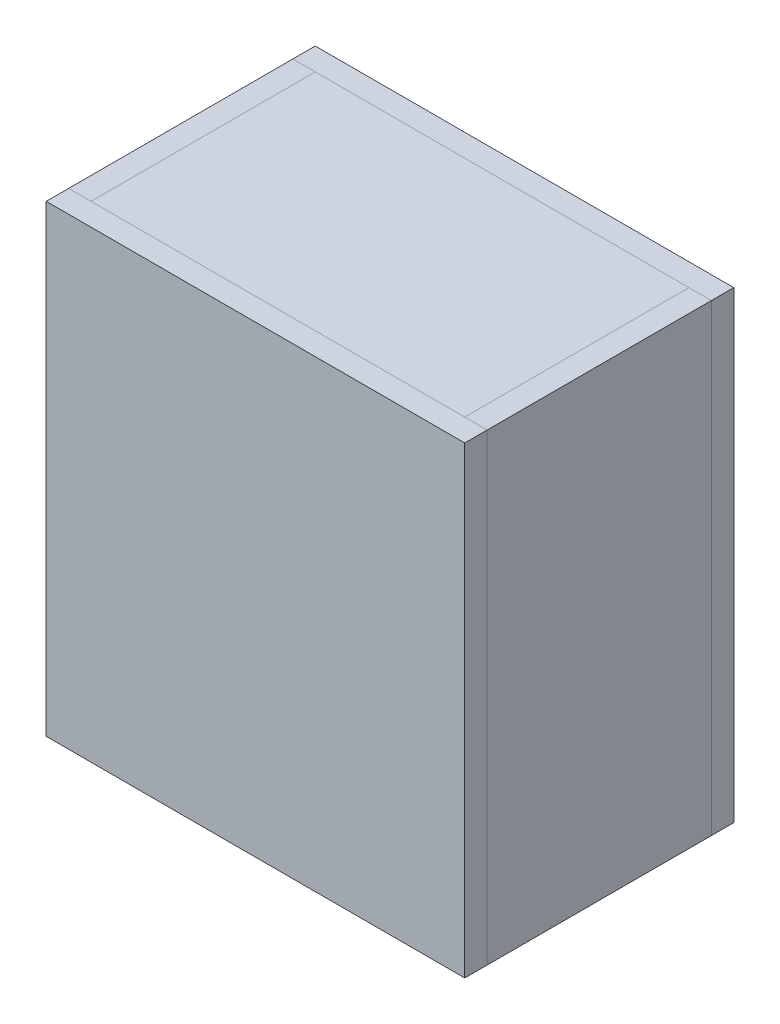
ISO-10303-21;
HEADER;
FILE_DESCRIPTION(('STEP AP214'),'2;1');
FILE_NAME('part.step','',(''),(''),'','','');
FILE_SCHEMA(('AUTOMOTIVE_DESIGN { 1 0 10303 214 1 1 1 1 }'));
ENDSEC;
DATA;
#1=APPLICATION_CONTEXT('core data for automotive mechanical design processes');
#2=APPLICATION_PROTOCOL_DEFINITION('international standard','automotive_design',2000,#1);
#3=PRODUCT_CONTEXT('',#1,'mechanical');
#4=PRODUCT('Part','Part','',(#3));
#5=PRODUCT_RELATED_PRODUCT_CATEGORY('part','',(#4));
#6=PRODUCT_DEFINITION_FORMATION('','',#4);
#7=PRODUCT_DEFINITION_CONTEXT('part definition',#1,'design');
#8=PRODUCT_DEFINITION('design','',#6,#7);
#9=PRODUCT_DEFINITION_SHAPE('','',#8);
#10=(LENGTH_UNIT() NAMED_UNIT(*) SI_UNIT(.MILLI.,.METRE.));
#11=(NAMED_UNIT(*) PLANE_ANGLE_UNIT() SI_UNIT($,.RADIAN.));
#12=(NAMED_UNIT(*) SI_UNIT($,.STERADIAN.) SOLID_ANGLE_UNIT());
#13=UNCERTAINTY_MEASURE_WITH_UNIT(LENGTH_MEASURE(1.E-05),#10,'distance_accuracy_value','');
#14=(GEOMETRIC_REPRESENTATION_CONTEXT(3) GLOBAL_UNCERTAINTY_ASSIGNED_CONTEXT((#13)) GLOBAL_UNIT_ASSIGNED_CONTEXT((#10,
#11,#12)) REPRESENTATION_CONTEXT('',''));
#15=CARTESIAN_POINT('',(0.,0.,0.));
#16=DIRECTION('',(0.,0.,1.));
#17=DIRECTION('',(1.,0.,0.));
#18=AXIS2_PLACEMENT_3D('',#15,#16,#17);
#19=CARTESIAN_POINT('',(0.,0.,180.));
#20=DIRECTION('',(-1.,0.,0.));
#21=DIRECTION('',(0.,0.,1.));
#22=AXIS2_PLACEMENT_3D('',#19,#20,#21);
#23=PLANE('',#22);
#24=DIRECTION('',(0.,1.,0.));
#25=VECTOR('',#24,1.);
#26=CARTESIAN_POINT('',(0.,0.,165.));
#27=LINE('',#26,#25);
#28=CARTESIAN_POINT('',(0.,0.,165.));
#29=VERTEX_POINT('',#28);
#30=CARTESIAN_POINT('',(0.,310.,165.));
#31=VERTEX_POINT('',#30);
#32=EDGE_CURVE('E113',#29,#31,#27,.T.);
#33=ORIENTED_EDGE('',*,*,#32,.T.);
#34=DIRECTION('',(0.,0.,-1.));
#35=VECTOR('',#34,1.);
#36=CARTESIAN_POINT('',(0.,310.,180.));
#37=LINE('',#36,#35);
#38=CARTESIAN_POINT('',(0.,310.,180.));
#39=VERTEX_POINT('',#38);
#40=EDGE_CURVE('E67',#39,#31,#37,.T.);
#41=ORIENTED_EDGE('',*,*,#40,.F.);
#42=DIRECTION('',(0.,1.,0.));
#43=VECTOR('',#42,1.);
#44=CARTESIAN_POINT('',(0.,0.,180.));
#45=LINE('',#44,#43);
#46=CARTESIAN_POINT('',(0.,0.,180.));
#47=VERTEX_POINT('',#46);
#48=EDGE_CURVE('E104',#47,#39,#45,.T.);
#49=ORIENTED_EDGE('',*,*,#48,.F.);
#50=DIRECTION('',(0.,0.,-1.));
#51=VECTOR('',#50,1.);
#52=CARTESIAN_POINT('',(0.,0.,180.));
#53=LINE('',#52,#51);
#54=EDGE_CURVE('E12',#47,#29,#53,.T.);
#55=ORIENTED_EDGE('',*,*,#54,.T.);
#56=EDGE_LOOP('',(#33,#41,#49,#55));
#57=FACE_BOUND('',#56,.T.);
#58=ADVANCED_FACE('F59',(#57),#23,.F.);
#59=CARTESIAN_POINT('',(-265.,310.,180.));
#60=DIRECTION('',(0.,-1.,0.));
#61=DIRECTION('',(0.,0.,-1.));
#62=AXIS2_PLACEMENT_3D('',#59,#60,#61);
#63=PLANE('',#62);
#64=DIRECTION('',(-1.,0.,0.));
#65=VECTOR('',#64,1.);
#66=CARTESIAN_POINT('',(-265.,310.,165.));
#67=LINE('',#66,#65);
#68=CARTESIAN_POINT('',(-280.,310.,165.));
#69=VERTEX_POINT('',#68);
#70=EDGE_CURVE('E92',#31,#69,#67,.T.);
#71=ORIENTED_EDGE('',*,*,#70,.T.);
#72=DIRECTION('',(0.,0.,-1.));
#73=VECTOR('',#72,1.);
#74=CARTESIAN_POINT('',(-280.,310.,180.));
#75=LINE('',#74,#73);
#76=CARTESIAN_POINT('',(-280.,310.,180.));
#77=VERTEX_POINT('',#76);
#78=EDGE_CURVE('E114',#77,#69,#75,.T.);
#79=ORIENTED_EDGE('',*,*,#78,.F.);
#80=DIRECTION('',(-1.,0.,0.));
#81=VECTOR('',#80,1.);
#82=CARTESIAN_POINT('',(0.,310.,180.));
#83=LINE('',#82,#81);
#84=EDGE_CURVE('E108',#39,#77,#83,.T.);
#85=ORIENTED_EDGE('',*,*,#84,.F.);
#86=ORIENTED_EDGE('',*,*,#40,.T.);
#87=EDGE_LOOP('',(#71,#79,#85,#86));
#88=FACE_BOUND('',#87,.T.);
#89=ADVANCED_FACE('F115',(#88),#63,.F.);
#90=CARTESIAN_POINT('',(-280.,310.,180.));
#91=DIRECTION('',(1.,0.,0.));
#92=DIRECTION('',(0.,0.,-1.));
#93=AXIS2_PLACEMENT_3D('',#90,#91,#92);
#94=PLANE('',#93);
#95=DIRECTION('',(0.,-1.,0.));
#96=VECTOR('',#95,1.);
#97=CARTESIAN_POINT('',(-280.,310.,165.));
#98=LINE('',#97,#96);
#99=CARTESIAN_POINT('',(-280.,0.,165.));
#100=VERTEX_POINT('',#99);
#101=EDGE_CURVE('E99',#69,#100,#98,.T.);
#102=ORIENTED_EDGE('',*,*,#101,.T.);
#103=DIRECTION('',(0.,0.,-1.));
#104=VECTOR('',#103,1.);
#105=CARTESIAN_POINT('',(-280.,0.,180.));
#106=LINE('',#105,#104);
#107=CARTESIAN_POINT('',(-280.,0.,180.));
#108=VERTEX_POINT('',#107);
#109=EDGE_CURVE('E119',#108,#100,#106,.T.);
#110=ORIENTED_EDGE('',*,*,#109,.F.);
#111=DIRECTION('',(0.,-1.,0.));
#112=VECTOR('',#111,1.);
#113=CARTESIAN_POINT('',(-280.,310.,180.));
#114=LINE('',#113,#112);
#115=EDGE_CURVE('E117',#77,#108,#114,.T.);
#116=ORIENTED_EDGE('',*,*,#115,.F.);
#117=ORIENTED_EDGE('',*,*,#78,.T.);
#118=EDGE_LOOP('',(#102,#110,#116,#117));
#119=FACE_BOUND('',#118,.T.);
#120=ADVANCED_FACE('F129',(#119),#94,.F.);
#121=CARTESIAN_POINT('',(-280.,0.,180.));
#122=DIRECTION('',(0.,1.,0.));
#123=DIRECTION('',(0.,0.,1.));
#124=AXIS2_PLACEMENT_3D('',#121,#122,#123);
#125=PLANE('',#124);
#126=DIRECTION('',(1.,0.,0.));
#127=VECTOR('',#126,1.);
#128=CARTESIAN_POINT('',(-280.,0.,165.));
#129=LINE('',#128,#127);
#130=EDGE_CURVE('E126',#100,#29,#129,.T.);
#131=ORIENTED_EDGE('',*,*,#130,.T.);
#132=ORIENTED_EDGE('',*,*,#54,.F.);
#133=DIRECTION('',(1.,0.,0.));
#134=VECTOR('',#133,1.);
#135=CARTESIAN_POINT('',(-265.,0.,180.));
#136=LINE('',#135,#134);
#137=EDGE_CURVE('E75',#108,#47,#136,.T.);
#138=ORIENTED_EDGE('',*,*,#137,.F.);
#139=ORIENTED_EDGE('',*,*,#109,.T.);
#140=EDGE_LOOP('',(#131,#132,#138,#139));
#141=FACE_BOUND('',#140,.T.);
#142=ADVANCED_FACE('F133',(#141),#125,.F.);
#143=CARTESIAN_POINT('',(0.,0.,180.));
#144=DIRECTION('',(0.,0.,1.));
#145=DIRECTION('',(1.,0.,0.));
#146=AXIS2_PLACEMENT_3D('',#143,#144,#145);
#147=PLANE('',#146);
#148=ORIENTED_EDGE('',*,*,#137,.T.);
#149=ORIENTED_EDGE('',*,*,#48,.T.);
#150=ORIENTED_EDGE('',*,*,#84,.T.);
#151=ORIENTED_EDGE('',*,*,#115,.T.);
#152=EDGE_LOOP('',(#148,#149,#150,#151));
#153=FACE_BOUND('',#152,.T.);
#154=ADVANCED_FACE('F106',(#153),#147,.T.);
#155=CARTESIAN_POINT('',(0.,0.,165.));
#156=DIRECTION('',(0.,0.,1.));
#157=DIRECTION('',(1.,0.,0.));
#158=AXIS2_PLACEMENT_3D('',#155,#156,#157);
#159=PLANE('',#158);
#160=ORIENTED_EDGE('',*,*,#32,.F.);
#161=ORIENTED_EDGE('',*,*,#130,.F.);
#162=ORIENTED_EDGE('',*,*,#101,.F.);
#163=ORIENTED_EDGE('',*,*,#70,.F.);
#164=EDGE_LOOP('',(#160,#161,#162,#163));
#165=FACE_BOUND('',#164,.T.);
#166=ADVANCED_FACE('F132',(#165),#159,.F.);
#167=CLOSED_SHELL('',(#58,#89,#120,#142,#154,#166));
#168=MANIFOLD_SOLID_BREP('B2',#167);
#169=CARTESIAN_POINT('',(0.,15.,165.));
#170=DIRECTION('',(0.,1.,0.));
#171=DIRECTION('',(0.,0.,1.));
#172=AXIS2_PLACEMENT_3D('',#169,#170,#171);
#173=PLANE('',#172);
#174=DIRECTION('',(1.,0.,0.));
#175=VECTOR('',#174,1.);
#176=CARTESIAN_POINT('',(0.,15.,15.));
#177=LINE('',#176,#175);
#178=CARTESIAN_POINT('',(-265.,15.,15.));
#179=VERTEX_POINT('',#178);
#180=CARTESIAN_POINT('',(-15.,15.,15.));
#181=VERTEX_POINT('',#180);
#182=EDGE_CURVE('E267',#179,#181,#177,.T.);
#183=ORIENTED_EDGE('',*,*,#182,.F.);
#184=DIRECTION('',(0.,0.,-1.));
#185=VECTOR('',#184,1.);
#186=CARTESIAN_POINT('',(-265.,15.,165.));
#187=LINE('',#186,#185);
#188=CARTESIAN_POINT('',(-265.,15.,165.));
#189=VERTEX_POINT('',#188);
#190=EDGE_CURVE('E57',#189,#179,#187,.T.);
#191=ORIENTED_EDGE('',*,*,#190,.F.);
#192=DIRECTION('',(1.,0.,0.));
#193=VECTOR('',#192,1.);
#194=CARTESIAN_POINT('',(0.,15.,165.));
#195=LINE('',#194,#193);
#196=CARTESIAN_POINT('',(-15.,15.,165.));
#197=VERTEX_POINT('',#196);
#198=EDGE_CURVE('E252',#189,#197,#195,.T.);
#199=ORIENTED_EDGE('',*,*,#198,.T.);
#200=DIRECTION('',(0.,0.,-1.));
#201=VECTOR('',#200,1.);
#202=CARTESIAN_POINT('',(-15.,15.,165.));
#203=LINE('',#202,#201);
#204=EDGE_CURVE('E220',#197,#181,#203,.T.);
#205=ORIENTED_EDGE('',*,*,#204,.T.);
#206=EDGE_LOOP('',(#183,#191,#199,#205));
#207=FACE_BOUND('',#206,.T.);
#208=ADVANCED_FACE('F204',(#207),#173,.T.);
#209=CARTESIAN_POINT('',(-265.,0.,165.));
#210=DIRECTION('',(1.,0.,0.));
#211=DIRECTION('',(0.,1.,0.));
#212=AXIS2_PLACEMENT_3D('',#209,#210,#211);
#213=PLANE('',#212);
#214=DIRECTION('',(0.,-1.,0.));
#215=VECTOR('',#214,1.);
#216=CARTESIAN_POINT('',(-265.,0.,15.));
#217=LINE('',#216,#215);
#218=CARTESIAN_POINT('',(-265.,0.,15.));
#219=VERTEX_POINT('',#218);
#220=EDGE_CURVE('E258',#179,#219,#217,.T.);
#221=ORIENTED_EDGE('',*,*,#220,.T.);
#222=DIRECTION('',(0.,0.,-1.));
#223=VECTOR('',#222,1.);
#224=CARTESIAN_POINT('',(-265.,0.,165.));
#225=LINE('',#224,#223);
#226=CARTESIAN_POINT('',(-265.,0.,165.));
#227=VERTEX_POINT('',#226);
#228=EDGE_CURVE('E212',#227,#219,#225,.T.);
#229=ORIENTED_EDGE('',*,*,#228,.F.);
#230=DIRECTION('',(0.,-1.,0.));
#231=VECTOR('',#230,1.);
#232=CARTESIAN_POINT('',(-265.,0.,165.));
#233=LINE('',#232,#231);
#234=EDGE_CURVE('E246',#189,#227,#233,.T.);
#235=ORIENTED_EDGE('',*,*,#234,.F.);
#236=ORIENTED_EDGE('',*,*,#190,.T.);
#237=EDGE_LOOP('',(#221,#229,#235,#236));
#238=FACE_BOUND('',#237,.T.);
#239=ADVANCED_FACE('F256',(#238),#213,.F.);
#240=CARTESIAN_POINT('',(0.,0.,165.));
#241=DIRECTION('',(0.,1.,0.));
#242=DIRECTION('',(0.,0.,1.));
#243=AXIS2_PLACEMENT_3D('',#240,#241,#242);
#244=PLANE('',#243);
#245=DIRECTION('',(1.,0.,0.));
#246=VECTOR('',#245,1.);
#247=CARTESIAN_POINT('',(0.,0.,15.));
#248=LINE('',#247,#246);
#249=CARTESIAN_POINT('',(-15.,0.,15.));
#250=VERTEX_POINT('',#249);
#251=EDGE_CURVE('E270',#219,#250,#248,.T.);
#252=ORIENTED_EDGE('',*,*,#251,.T.);
#253=DIRECTION('',(0.,0.,-1.));
#254=VECTOR('',#253,1.);
#255=CARTESIAN_POINT('',(-15.,0.,165.));
#256=LINE('',#255,#254);
#257=CARTESIAN_POINT('',(-15.,0.,165.));
#258=VERTEX_POINT('',#257);
#259=EDGE_CURVE('E234',#258,#250,#256,.T.);
#260=ORIENTED_EDGE('',*,*,#259,.F.);
#261=DIRECTION('',(1.,0.,0.));
#262=VECTOR('',#261,1.);
#263=CARTESIAN_POINT('',(0.,0.,165.));
#264=LINE('',#263,#262);
#265=EDGE_CURVE('E251',#227,#258,#264,.T.);
#266=ORIENTED_EDGE('',*,*,#265,.F.);
#267=ORIENTED_EDGE('',*,*,#228,.T.);
#268=EDGE_LOOP('',(#252,#260,#266,#267));
#269=FACE_BOUND('',#268,.T.);
#270=ADVANCED_FACE('F261',(#269),#244,.F.);
#271=CARTESIAN_POINT('',(-15.,0.,165.));
#272=DIRECTION('',(1.,0.,0.));
#273=DIRECTION('',(0.,1.,0.));
#274=AXIS2_PLACEMENT_3D('',#271,#272,#273);
#275=PLANE('',#274);
#276=DIRECTION('',(0.,-1.,0.));
#277=VECTOR('',#276,1.);
#278=CARTESIAN_POINT('',(-15.,0.,15.));
#279=LINE('',#278,#277);
#280=EDGE_CURVE('E272',#181,#250,#279,.T.);
#281=ORIENTED_EDGE('',*,*,#280,.F.);
#282=ORIENTED_EDGE('',*,*,#204,.F.);
#283=DIRECTION('',(0.,-1.,0.));
#284=VECTOR('',#283,1.);
#285=CARTESIAN_POINT('',(-15.,0.,165.));
#286=LINE('',#285,#284);
#287=EDGE_CURVE('E262',#197,#258,#286,.T.);
#288=ORIENTED_EDGE('',*,*,#287,.T.);
#289=ORIENTED_EDGE('',*,*,#259,.T.);
#290=EDGE_LOOP('',(#281,#282,#288,#289));
#291=FACE_BOUND('',#290,.T.);
#292=ADVANCED_FACE('F277',(#291),#275,.T.);
#293=CARTESIAN_POINT('',(0.,0.,165.));
#294=DIRECTION('',(0.,0.,1.));
#295=DIRECTION('',(1.,0.,0.));
#296=AXIS2_PLACEMENT_3D('',#293,#294,#295);
#297=PLANE('',#296);
#298=ORIENTED_EDGE('',*,*,#198,.F.);
#299=ORIENTED_EDGE('',*,*,#234,.T.);
#300=ORIENTED_EDGE('',*,*,#265,.T.);
#301=ORIENTED_EDGE('',*,*,#287,.F.);
#302=EDGE_LOOP('',(#298,#299,#300,#301));
#303=FACE_BOUND('',#302,.T.);
#304=ADVANCED_FACE('F248',(#303),#297,.T.);
#305=CARTESIAN_POINT('',(0.,0.,15.));
#306=DIRECTION('',(0.,0.,1.));
#307=DIRECTION('',(1.,0.,0.));
#308=AXIS2_PLACEMENT_3D('',#305,#306,#307);
#309=PLANE('',#308);
#310=ORIENTED_EDGE('',*,*,#182,.T.);
#311=ORIENTED_EDGE('',*,*,#280,.T.);
#312=ORIENTED_EDGE('',*,*,#251,.F.);
#313=ORIENTED_EDGE('',*,*,#220,.F.);
#314=EDGE_LOOP('',(#310,#311,#312,#313));
#315=FACE_BOUND('',#314,.T.);
#316=ADVANCED_FACE('F284',(#315),#309,.F.);
#317=CLOSED_SHELL('',(#208,#239,#270,#292,#304,#316));
#318=MANIFOLD_SOLID_BREP('B6_NOT_SHOWN',#317);
#319=CARTESIAN_POINT('',(-15.,0.,165.));
#320=DIRECTION('',(1.,0.,0.));
#321=DIRECTION('',(0.,1.,0.));
#322=AXIS2_PLACEMENT_3D('',#319,#320,#321);
#323=PLANE('',#322);
#324=DIRECTION('',(0.,-1.,0.));
#325=VECTOR('',#324,1.);
#326=CARTESIAN_POINT('',(-15.,0.,15.));
#327=LINE('',#326,#325);
#328=CARTESIAN_POINT('',(-15.0000000000001,310.,15.));
#329=VERTEX_POINT('',#328);
#330=CARTESIAN_POINT('',(-15.0000000000001,295.,15.));
#331=VERTEX_POINT('',#330);
#332=EDGE_CURVE('E402',#329,#331,#327,.T.);
#333=ORIENTED_EDGE('',*,*,#332,.F.);
#334=DIRECTION('',(0.,0.,-1.));
#335=VECTOR('',#334,1.);
#336=CARTESIAN_POINT('',(-15.0000000000001,310.,165.));
#337=LINE('',#336,#335);
#338=CARTESIAN_POINT('',(-15.0000000000001,310.,165.));
#339=VERTEX_POINT('',#338);
#340=EDGE_CURVE('E202',#339,#329,#337,.T.);
#341=ORIENTED_EDGE('',*,*,#340,.F.);
#342=DIRECTION('',(0.,-1.,0.));
#343=VECTOR('',#342,1.);
#344=CARTESIAN_POINT('',(-15.,0.,165.));
#345=LINE('',#344,#343);
#346=CARTESIAN_POINT('',(-15.0000000000001,295.,165.));
#347=VERTEX_POINT('',#346);
#348=EDGE_CURVE('E390',#339,#347,#345,.T.);
#349=ORIENTED_EDGE('',*,*,#348,.T.);
#350=DIRECTION('',(0.,0.,-1.));
#351=VECTOR('',#350,1.);
#352=CARTESIAN_POINT('',(-15.0000000000001,295.,165.));
#353=LINE('',#352,#351);
#354=EDGE_CURVE('E379',#347,#331,#353,.T.);
#355=ORIENTED_EDGE('',*,*,#354,.T.);
#356=EDGE_LOOP('',(#333,#341,#349,#355));
#357=FACE_BOUND('',#356,.T.);
#358=ADVANCED_FACE('F340',(#357),#323,.T.);
#359=CARTESIAN_POINT('',(0.,310.,165.));
#360=DIRECTION('',(0.,-1.,0.));
#361=DIRECTION('',(0.,0.,-1.));
#362=AXIS2_PLACEMENT_3D('',#359,#360,#361);
#363=PLANE('',#362);
#364=DIRECTION('',(-1.,0.,0.));
#365=VECTOR('',#364,1.);
#366=CARTESIAN_POINT('',(0.,310.,15.));
#367=LINE('',#366,#365);
#368=CARTESIAN_POINT('',(-265.,310.,15.));
#369=VERTEX_POINT('',#368);
#370=EDGE_CURVE('E395',#329,#369,#367,.T.);
#371=ORIENTED_EDGE('',*,*,#370,.T.);
#372=DIRECTION('',(0.,0.,-1.));
#373=VECTOR('',#372,1.);
#374=CARTESIAN_POINT('',(-265.,310.,165.));
#375=LINE('',#374,#373);
#376=CARTESIAN_POINT('',(-265.,310.,165.));
#377=VERTEX_POINT('',#376);
#378=EDGE_CURVE('E348',#377,#369,#375,.T.);
#379=ORIENTED_EDGE('',*,*,#378,.F.);
#380=DIRECTION('',(-1.,0.,0.));
#381=VECTOR('',#380,1.);
#382=CARTESIAN_POINT('',(0.,310.,165.));
#383=LINE('',#382,#381);
#384=EDGE_CURVE('E385',#339,#377,#383,.T.);
#385=ORIENTED_EDGE('',*,*,#384,.F.);
#386=ORIENTED_EDGE('',*,*,#340,.T.);
#387=EDGE_LOOP('',(#371,#379,#385,#386));
#388=FACE_BOUND('',#387,.T.);
#389=ADVANCED_FACE('F393',(#388),#363,.F.);
#390=CARTESIAN_POINT('',(-265.,0.,165.));
#391=DIRECTION('',(1.,0.,0.));
#392=DIRECTION('',(0.,1.,0.));
#393=AXIS2_PLACEMENT_3D('',#390,#391,#392);
#394=PLANE('',#393);
#395=DIRECTION('',(0.,-1.,0.));
#396=VECTOR('',#395,1.);
#397=CARTESIAN_POINT('',(-265.,0.,15.));
#398=LINE('',#397,#396);
#399=CARTESIAN_POINT('',(-265.,295.,15.));
#400=VERTEX_POINT('',#399);
#401=EDGE_CURVE('E372',#369,#400,#398,.T.);
#402=ORIENTED_EDGE('',*,*,#401,.T.);
#403=DIRECTION('',(0.,0.,-1.));
#404=VECTOR('',#403,1.);
#405=CARTESIAN_POINT('',(-265.,295.,165.));
#406=LINE('',#405,#404);
#407=CARTESIAN_POINT('',(-265.,295.,165.));
#408=VERTEX_POINT('',#407);
#409=EDGE_CURVE('E396',#408,#400,#406,.T.);
#410=ORIENTED_EDGE('',*,*,#409,.F.);
#411=DIRECTION('',(0.,-1.,0.));
#412=VECTOR('',#411,1.);
#413=CARTESIAN_POINT('',(-265.,0.,165.));
#414=LINE('',#413,#412);
#415=EDGE_CURVE('E389',#377,#408,#414,.T.);
#416=ORIENTED_EDGE('',*,*,#415,.F.);
#417=ORIENTED_EDGE('',*,*,#378,.T.);
#418=EDGE_LOOP('',(#402,#410,#416,#417));
#419=FACE_BOUND('',#418,.T.);
#420=ADVANCED_FACE('F397',(#419),#394,.F.);
#421=CARTESIAN_POINT('',(0.,295.,165.));
#422=DIRECTION('',(0.,1.,0.));
#423=DIRECTION('',(0.,0.,1.));
#424=AXIS2_PLACEMENT_3D('',#421,#422,#423);
#425=PLANE('',#424);
#426=DIRECTION('',(1.,0.,0.));
#427=VECTOR('',#426,1.);
#428=CARTESIAN_POINT('',(0.,295.,15.));
#429=LINE('',#428,#427);
#430=EDGE_CURVE('E407',#400,#331,#429,.T.);
#431=ORIENTED_EDGE('',*,*,#430,.T.);
#432=ORIENTED_EDGE('',*,*,#354,.F.);
#433=DIRECTION('',(1.,0.,0.));
#434=VECTOR('',#433,1.);
#435=CARTESIAN_POINT('',(0.,295.,165.));
#436=LINE('',#435,#434);
#437=EDGE_CURVE('E356',#408,#347,#436,.T.);
#438=ORIENTED_EDGE('',*,*,#437,.F.);
#439=ORIENTED_EDGE('',*,*,#409,.T.);
#440=EDGE_LOOP('',(#431,#432,#438,#439));
#441=FACE_BOUND('',#440,.T.);
#442=ADVANCED_FACE('F412',(#441),#425,.F.);
#443=CARTESIAN_POINT('',(0.,0.,165.));
#444=DIRECTION('',(0.,0.,1.));
#445=DIRECTION('',(1.,0.,0.));
#446=AXIS2_PLACEMENT_3D('',#443,#444,#445);
#447=PLANE('',#446);
#448=ORIENTED_EDGE('',*,*,#348,.F.);
#449=ORIENTED_EDGE('',*,*,#384,.T.);
#450=ORIENTED_EDGE('',*,*,#415,.T.);
#451=ORIENTED_EDGE('',*,*,#437,.T.);
#452=EDGE_LOOP('',(#448,#449,#450,#451));
#453=FACE_BOUND('',#452,.T.);
#454=ADVANCED_FACE('F387',(#453),#447,.T.);
#455=CARTESIAN_POINT('',(0.,0.,15.));
#456=DIRECTION('',(0.,0.,1.));
#457=DIRECTION('',(1.,0.,0.));
#458=AXIS2_PLACEMENT_3D('',#455,#456,#457);
#459=PLANE('',#458);
#460=ORIENTED_EDGE('',*,*,#332,.T.);
#461=ORIENTED_EDGE('',*,*,#430,.F.);
#462=ORIENTED_EDGE('',*,*,#401,.F.);
#463=ORIENTED_EDGE('',*,*,#370,.F.);
#464=EDGE_LOOP('',(#460,#461,#462,#463));
#465=FACE_BOUND('',#464,.T.);
#466=ADVANCED_FACE('F414',(#465),#459,.F.);
#467=CLOSED_SHELL('',(#358,#389,#420,#442,#454,#466));
#468=MANIFOLD_SOLID_BREP('B51',#467);
#469=CARTESIAN_POINT('',(-15.,0.,165.));
#470=DIRECTION('',(1.,0.,0.));
#471=DIRECTION('',(0.,1.,0.));
#472=AXIS2_PLACEMENT_3D('',#469,#470,#471);
#473=PLANE('',#472);
#474=DIRECTION('',(0.,-1.,0.));
#475=VECTOR('',#474,1.);
#476=CARTESIAN_POINT('',(-15.,0.,115.));
#477=LINE('',#476,#475);
#478=CARTESIAN_POINT('',(-15.0000000000001,267.021140194515,115.));
#479=VERTEX_POINT('',#478);
#480=CARTESIAN_POINT('',(-15.,47.0211401945149,115.));
#481=VERTEX_POINT('',#480);
#482=EDGE_CURVE('E492',#479,#481,#477,.T.);
#483=ORIENTED_EDGE('',*,*,#482,.T.);
#484=DIRECTION('',(0.,0.,-1.));
#485=VECTOR('',#484,1.);
#486=CARTESIAN_POINT('',(-15.,47.0211401945149,0.));
#487=LINE('',#486,#485);
#488=CARTESIAN_POINT('',(-15.,47.0211401945149,105.));
#489=VERTEX_POINT('',#488);
#490=EDGE_CURVE('E570',#481,#489,#487,.T.);
#491=ORIENTED_EDGE('',*,*,#490,.T.);
#492=DIRECTION('',(0.,-1.,0.));
#493=VECTOR('',#492,1.);
#494=CARTESIAN_POINT('',(-15.,0.,105.));
#495=LINE('',#494,#493);
#496=CARTESIAN_POINT('',(-15.0000000000001,267.021140194515,105.));
#497=VERTEX_POINT('',#496);
#498=EDGE_CURVE('E585',#497,#489,#495,.T.);
#499=ORIENTED_EDGE('',*,*,#498,.F.);
#500=DIRECTION('',(0.,0.,-1.));
#501=VECTOR('',#500,1.);
#502=CARTESIAN_POINT('',(-15.0000000000001,267.021140194515,0.));
#503=LINE('',#502,#501);
#504=EDGE_CURVE('E497',#479,#497,#503,.T.);
#505=ORIENTED_EDGE('',*,*,#504,.F.);
#506=EDGE_LOOP('',(#483,#491,#499,#505));
#507=FACE_BOUND('',#506,.T.);
#508=DIRECTION('',(0.,-1.,0.));
#509=VECTOR('',#508,1.);
#510=CARTESIAN_POINT('',(-15.,0.,55.));
#511=LINE('',#510,#509);
#512=CARTESIAN_POINT('',(-15.0000000000001,267.021140194515,55.));
#513=VERTEX_POINT('',#512);
#514=CARTESIAN_POINT('',(-15.,50.3349532235441,55.));
#515=VERTEX_POINT('',#514);
#516=EDGE_CURVE('E635',#513,#515,#511,.T.);
#517=ORIENTED_EDGE('',*,*,#516,.T.);
#518=DIRECTION('',(0.,0.,-1.));
#519=VECTOR('',#518,1.);
#520=CARTESIAN_POINT('',(-15.,50.3349532235441,0.));
#521=LINE('',#520,#519);
#522=CARTESIAN_POINT('',(-15.,50.3349532235441,45.));
#523=VERTEX_POINT('',#522);
#524=EDGE_CURVE('E632',#515,#523,#521,.T.);
#525=ORIENTED_EDGE('',*,*,#524,.T.);
#526=DIRECTION('',(0.,-1.,0.));
#527=VECTOR('',#526,1.);
#528=CARTESIAN_POINT('',(-15.,0.,45.));
#529=LINE('',#528,#527);
#530=CARTESIAN_POINT('',(-15.0000000000001,267.021140194515,45.));
#531=VERTEX_POINT('',#530);
#532=EDGE_CURVE('E621',#531,#523,#529,.T.);
#533=ORIENTED_EDGE('',*,*,#532,.F.);
#534=DIRECTION('',(0.,0.,-1.));
#535=VECTOR('',#534,1.);
#536=CARTESIAN_POINT('',(-15.0000000000001,267.021140194515,0.));
#537=LINE('',#536,#535);
#538=EDGE_CURVE('E638',#513,#531,#537,.T.);
#539=ORIENTED_EDGE('',*,*,#538,.F.);
#540=EDGE_LOOP('',(#517,#525,#533,#539));
#541=FACE_BOUND('',#540,.T.);
#542=DIRECTION('',(0.,-1.,0.));
#543=VECTOR('',#542,1.);
#544=CARTESIAN_POINT('',(-15.,0.,15.));
#545=LINE('',#544,#543);
#546=CARTESIAN_POINT('',(-15.0000000000001,310.,15.));
#547=VERTEX_POINT('',#546);
#548=CARTESIAN_POINT('',(-15.,0.,15.));
#549=VERTEX_POINT('',#548);
#550=EDGE_CURVE('E574',#547,#549,#545,.T.);
#551=ORIENTED_EDGE('',*,*,#550,.T.);
#552=DIRECTION('',(0.,0.,-1.));
#553=VECTOR('',#552,1.);
#554=CARTESIAN_POINT('',(-15.,0.,165.));
#555=LINE('',#554,#553);
#556=CARTESIAN_POINT('',(-15.,0.,165.));
#557=VERTEX_POINT('',#556);
#558=EDGE_CURVE('E338',#557,#549,#555,.T.);
#559=ORIENTED_EDGE('',*,*,#558,.F.);
#560=DIRECTION('',(0.,-1.,0.));
#561=VECTOR('',#560,1.);
#562=CARTESIAN_POINT('',(-15.,0.,165.));
#563=LINE('',#562,#561);
#564=CARTESIAN_POINT('',(-15.0000000000001,310.,165.));
#565=VERTEX_POINT('',#564);
#566=EDGE_CURVE('E659',#565,#557,#563,.T.);
#567=ORIENTED_EDGE('',*,*,#566,.F.);
#568=DIRECTION('',(0.,0.,-1.));
#569=VECTOR('',#568,1.);
#570=CARTESIAN_POINT('',(-15.0000000000001,310.,165.));
#571=LINE('',#570,#569);
#572=EDGE_CURVE('E673',#565,#547,#571,.T.);
#573=ORIENTED_EDGE('',*,*,#572,.T.);
#574=EDGE_LOOP('',(#551,#559,#567,#573));
#575=FACE_BOUND('',#574,.T.);
#576=ADVANCED_FACE('F477',(#507,#541,#575),#473,.F.);
#577=CARTESIAN_POINT('',(0.,0.,165.));
#578=DIRECTION('',(0.,1.,0.));
#579=DIRECTION('',(0.,0.,1.));
#580=AXIS2_PLACEMENT_3D('',#577,#578,#579);
#581=PLANE('',#580);
#582=DIRECTION('',(1.,0.,0.));
#583=VECTOR('',#582,1.);
#584=CARTESIAN_POINT('',(0.,0.,15.));
#585=LINE('',#584,#583);
#586=CARTESIAN_POINT('',(0.,0.,15.));
#587=VERTEX_POINT('',#586);
#588=EDGE_CURVE('E677',#549,#587,#585,.T.);
#589=ORIENTED_EDGE('',*,*,#588,.T.);
#590=DIRECTION('',(0.,0.,-1.));
#591=VECTOR('',#590,1.);
#592=CARTESIAN_POINT('',(0.,0.,165.));
#593=LINE('',#592,#591);
#594=CARTESIAN_POINT('',(0.,0.,165.));
#595=VERTEX_POINT('',#594);
#596=EDGE_CURVE('E485',#595,#587,#593,.T.);
#597=ORIENTED_EDGE('',*,*,#596,.F.);
#598=DIRECTION('',(1.,0.,0.));
#599=VECTOR('',#598,1.);
#600=CARTESIAN_POINT('',(0.,0.,165.));
#601=LINE('',#600,#599);
#602=EDGE_CURVE('E663',#557,#595,#601,.T.);
#603=ORIENTED_EDGE('',*,*,#602,.F.);
#604=ORIENTED_EDGE('',*,*,#558,.T.);
#605=EDGE_LOOP('',(#589,#597,#603,#604));
#606=FACE_BOUND('',#605,.T.);
#607=ADVANCED_FACE('F713',(#606),#581,.F.);
#608=CARTESIAN_POINT('',(0.,0.,165.));
#609=DIRECTION('',(-1.,0.,0.));
#610=DIRECTION('',(0.,0.,1.));
#611=AXIS2_PLACEMENT_3D('',#608,#609,#610);
#612=PLANE('',#611);
#613=DIRECTION('',(0.,1.,0.));
#614=VECTOR('',#613,1.);
#615=CARTESIAN_POINT('',(0.,0.,15.));
#616=LINE('',#615,#614);
#617=CARTESIAN_POINT('',(0.,310.,15.));
#618=VERTEX_POINT('',#617);
#619=EDGE_CURVE('E680',#587,#618,#616,.T.);
#620=ORIENTED_EDGE('',*,*,#619,.T.);
#621=DIRECTION('',(0.,0.,-1.));
#622=VECTOR('',#621,1.);
#623=CARTESIAN_POINT('',(0.,310.,165.));
#624=LINE('',#623,#622);
#625=CARTESIAN_POINT('',(0.,310.,165.));
#626=VERTEX_POINT('',#625);
#627=EDGE_CURVE('E688',#626,#618,#624,.T.);
#628=ORIENTED_EDGE('',*,*,#627,.F.);
#629=DIRECTION('',(0.,1.,0.));
#630=VECTOR('',#629,1.);
#631=CARTESIAN_POINT('',(0.,0.,165.));
#632=LINE('',#631,#630);
#633=EDGE_CURVE('E667',#595,#626,#632,.T.);
#634=ORIENTED_EDGE('',*,*,#633,.F.);
#635=ORIENTED_EDGE('',*,*,#596,.T.);
#636=EDGE_LOOP('',(#620,#628,#634,#635));
#637=FACE_BOUND('',#636,.T.);
#638=ADVANCED_FACE('F697',(#637),#612,.F.);
#639=CARTESIAN_POINT('',(0.,310.,165.));
#640=DIRECTION('',(0.,-1.,0.));
#641=DIRECTION('',(0.,0.,-1.));
#642=AXIS2_PLACEMENT_3D('',#639,#640,#641);
#643=PLANE('',#642);
#644=DIRECTION('',(-1.,0.,0.));
#645=VECTOR('',#644,1.);
#646=CARTESIAN_POINT('',(0.,310.,15.));
#647=LINE('',#646,#645);
#648=EDGE_CURVE('E664',#618,#547,#647,.T.);
#649=ORIENTED_EDGE('',*,*,#648,.T.);
#650=ORIENTED_EDGE('',*,*,#572,.F.);
#651=DIRECTION('',(-1.,0.,0.));
#652=VECTOR('',#651,1.);
#653=CARTESIAN_POINT('',(0.,310.,165.));
#654=LINE('',#653,#652);
#655=EDGE_CURVE('E670',#626,#565,#654,.T.);
#656=ORIENTED_EDGE('',*,*,#655,.F.);
#657=ORIENTED_EDGE('',*,*,#627,.T.);
#658=EDGE_LOOP('',(#649,#650,#656,#657));
#659=FACE_BOUND('',#658,.T.);
#660=ADVANCED_FACE('F706',(#659),#643,.F.);
#661=CARTESIAN_POINT('',(0.,0.,165.));
#662=DIRECTION('',(0.,0.,1.));
#663=DIRECTION('',(1.,0.,0.));
#664=AXIS2_PLACEMENT_3D('',#661,#662,#663);
#665=PLANE('',#664);
#666=ORIENTED_EDGE('',*,*,#566,.T.);
#667=ORIENTED_EDGE('',*,*,#602,.T.);
#668=ORIENTED_EDGE('',*,*,#633,.T.);
#669=ORIENTED_EDGE('',*,*,#655,.T.);
#670=EDGE_LOOP('',(#666,#667,#668,#669));
#671=FACE_BOUND('',#670,.T.);
#672=ADVANCED_FACE('F712',(#671),#665,.T.);
#673=CARTESIAN_POINT('',(0.,0.,15.));
#674=DIRECTION('',(0.,0.,1.));
#675=DIRECTION('',(1.,0.,0.));
#676=AXIS2_PLACEMENT_3D('',#673,#674,#675);
#677=PLANE('',#676);
#678=ORIENTED_EDGE('',*,*,#550,.F.);
#679=ORIENTED_EDGE('',*,*,#648,.F.);
#680=ORIENTED_EDGE('',*,*,#619,.F.);
#681=ORIENTED_EDGE('',*,*,#588,.F.);
#682=EDGE_LOOP('',(#678,#679,#680,#681));
#683=FACE_BOUND('',#682,.T.);
#684=ADVANCED_FACE('F703',(#683),#677,.F.);
#685=CARTESIAN_POINT('',(-182.,50.3349532235441,0.));
#686=DIRECTION('',(0.,-1.,0.));
#687=DIRECTION('',(1.,0.,0.));
#688=AXIS2_PLACEMENT_3D('',#685,#686,#687);
#689=PLANE('',#688);
#690=ORIENTED_EDGE('',*,*,#524,.F.);
#691=DIRECTION('',(1.,0.,0.));
#692=VECTOR('',#691,1.);
#693=CARTESIAN_POINT('',(-182.,50.3349532235441,55.));
#694=LINE('',#693,#692);
#695=CARTESIAN_POINT('',(-182.,50.3349532235441,55.));
#696=VERTEX_POINT('',#695);
#697=EDGE_CURVE('E600',#696,#515,#694,.T.);
#698=ORIENTED_EDGE('',*,*,#697,.F.);
#699=DIRECTION('',(0.,0.,-1.));
#700=VECTOR('',#699,1.);
#701=CARTESIAN_POINT('',(-182.,50.3349532235441,0.));
#702=LINE('',#701,#700);
#703=CARTESIAN_POINT('',(-182.,50.3349532235441,45.));
#704=VERTEX_POINT('',#703);
#705=EDGE_CURVE('E616',#696,#704,#702,.T.);
#706=ORIENTED_EDGE('',*,*,#705,.T.);
#707=DIRECTION('',(1.,0.,0.));
#708=VECTOR('',#707,1.);
#709=CARTESIAN_POINT('',(-182.,50.3349532235441,45.));
#710=LINE('',#709,#708);
#711=EDGE_CURVE('E631',#704,#523,#710,.T.);
#712=ORIENTED_EDGE('',*,*,#711,.T.);
#713=EDGE_LOOP('',(#690,#698,#706,#712));
#714=FACE_BOUND('',#713,.T.);
#715=ADVANCED_FACE('F725',(#714),#689,.T.);
#716=CARTESIAN_POINT('',(-182.,0.,55.));
#717=DIRECTION('',(0.,0.,1.));
#718=DIRECTION('',(1.,0.,0.));
#719=AXIS2_PLACEMENT_3D('',#716,#717,#718);
#720=PLANE('',#719);
#721=ORIENTED_EDGE('',*,*,#516,.F.);
#722=DIRECTION('',(1.,0.,0.));
#723=VECTOR('',#722,1.);
#724=CARTESIAN_POINT('',(-182.,267.021140194515,55.));
#725=LINE('',#724,#723);
#726=CARTESIAN_POINT('',(-182.,267.021140194515,55.));
#727=VERTEX_POINT('',#726);
#728=EDGE_CURVE('E652',#727,#513,#725,.T.);
#729=ORIENTED_EDGE('',*,*,#728,.F.);
#730=DIRECTION('',(0.,-1.,0.));
#731=VECTOR('',#730,1.);
#732=CARTESIAN_POINT('',(-182.,0.,55.));
#733=LINE('',#732,#731);
#734=EDGE_CURVE('E620',#727,#696,#733,.T.);
#735=ORIENTED_EDGE('',*,*,#734,.T.);
#736=ORIENTED_EDGE('',*,*,#697,.T.);
#737=EDGE_LOOP('',(#721,#729,#735,#736));
#738=FACE_BOUND('',#737,.T.);
#739=ADVANCED_FACE('F730',(#738),#720,.T.);
#740=CARTESIAN_POINT('',(-182.,267.021140194515,0.));
#741=DIRECTION('',(0.,-1.,0.));
#742=DIRECTION('',(1.,0.,0.));
#743=AXIS2_PLACEMENT_3D('',#740,#741,#742);
#744=PLANE('',#743);
#745=ORIENTED_EDGE('',*,*,#538,.T.);
#746=DIRECTION('',(1.,0.,0.));
#747=VECTOR('',#746,1.);
#748=CARTESIAN_POINT('',(-182.,267.021140194515,45.));
#749=LINE('',#748,#747);
#750=CARTESIAN_POINT('',(-182.,267.021140194515,45.));
#751=VERTEX_POINT('',#750);
#752=EDGE_CURVE('E648',#751,#531,#749,.T.);
#753=ORIENTED_EDGE('',*,*,#752,.F.);
#754=DIRECTION('',(0.,0.,-1.));
#755=VECTOR('',#754,1.);
#756=CARTESIAN_POINT('',(-182.,267.021140194515,0.));
#757=LINE('',#756,#755);
#758=EDGE_CURVE('E625',#727,#751,#757,.T.);
#759=ORIENTED_EDGE('',*,*,#758,.F.);
#760=ORIENTED_EDGE('',*,*,#728,.T.);
#761=EDGE_LOOP('',(#745,#753,#759,#760));
#762=FACE_BOUND('',#761,.T.);
#763=ADVANCED_FACE('F734',(#762),#744,.F.);
#764=CARTESIAN_POINT('',(-182.,0.,45.));
#765=DIRECTION('',(0.,0.,1.));
#766=DIRECTION('',(1.,0.,0.));
#767=AXIS2_PLACEMENT_3D('',#764,#765,#766);
#768=PLANE('',#767);
#769=ORIENTED_EDGE('',*,*,#532,.T.);
#770=ORIENTED_EDGE('',*,*,#711,.F.);
#771=DIRECTION('',(0.,-1.,0.));
#772=VECTOR('',#771,1.);
#773=CARTESIAN_POINT('',(-182.,0.,45.));
#774=LINE('',#773,#772);
#775=EDGE_CURVE('E628',#751,#704,#774,.T.);
#776=ORIENTED_EDGE('',*,*,#775,.F.);
#777=ORIENTED_EDGE('',*,*,#752,.T.);
#778=EDGE_LOOP('',(#769,#770,#776,#777));
#779=FACE_BOUND('',#778,.T.);
#780=ADVANCED_FACE('F738',(#779),#768,.F.);
#781=CARTESIAN_POINT('',(-182.,0.,0.));
#782=DIRECTION('',(-1.,0.,0.));
#783=DIRECTION('',(0.,-1.,0.));
#784=AXIS2_PLACEMENT_3D('',#781,#782,#783);
#785=PLANE('',#784);
#786=ORIENTED_EDGE('',*,*,#705,.F.);
#787=ORIENTED_EDGE('',*,*,#734,.F.);
#788=ORIENTED_EDGE('',*,*,#758,.T.);
#789=ORIENTED_EDGE('',*,*,#775,.T.);
#790=EDGE_LOOP('',(#786,#787,#788,#789));
#791=FACE_BOUND('',#790,.T.);
#792=ADVANCED_FACE('F742',(#791),#785,.T.);
#793=CARTESIAN_POINT('',(-182.,47.0211401945149,0.));
#794=DIRECTION('',(0.,-1.,0.));
#795=DIRECTION('',(1.,0.,0.));
#796=AXIS2_PLACEMENT_3D('',#793,#794,#795);
#797=PLANE('',#796);
#798=ORIENTED_EDGE('',*,*,#490,.F.);
#799=DIRECTION('',(1.,0.,0.));
#800=VECTOR('',#799,1.);
#801=CARTESIAN_POINT('',(-182.,47.0211401945149,115.));
#802=LINE('',#801,#800);
#803=CARTESIAN_POINT('',(-182.,47.0211401945149,115.));
#804=VERTEX_POINT('',#803);
#805=EDGE_CURVE('E565',#804,#481,#802,.T.);
#806=ORIENTED_EDGE('',*,*,#805,.F.);
#807=DIRECTION('',(0.,0.,-1.));
#808=VECTOR('',#807,1.);
#809=CARTESIAN_POINT('',(-182.,47.0211401945149,0.));
#810=LINE('',#809,#808);
#811=CARTESIAN_POINT('',(-182.,47.0211401945149,105.));
#812=VERTEX_POINT('',#811);
#813=EDGE_CURVE('E569',#804,#812,#810,.T.);
#814=ORIENTED_EDGE('',*,*,#813,.T.);
#815=DIRECTION('',(1.,0.,0.));
#816=VECTOR('',#815,1.);
#817=CARTESIAN_POINT('',(-182.,47.0211401945149,105.));
#818=LINE('',#817,#816);
#819=EDGE_CURVE('E597',#812,#489,#818,.T.);
#820=ORIENTED_EDGE('',*,*,#819,.T.);
#821=EDGE_LOOP('',(#798,#806,#814,#820));
#822=FACE_BOUND('',#821,.T.);
#823=ADVANCED_FACE('F567',(#822),#797,.T.);
#824=CARTESIAN_POINT('',(-182.,0.,115.));
#825=DIRECTION('',(0.,0.,1.));
#826=DIRECTION('',(1.,0.,0.));
#827=AXIS2_PLACEMENT_3D('',#824,#825,#826);
#828=PLANE('',#827);
#829=ORIENTED_EDGE('',*,*,#482,.F.);
#830=DIRECTION('',(1.,0.,0.));
#831=VECTOR('',#830,1.);
#832=CARTESIAN_POINT('',(-182.,267.021140194515,115.));
#833=LINE('',#832,#831);
#834=CARTESIAN_POINT('',(-182.,267.021140194515,115.));
#835=VERTEX_POINT('',#834);
#836=EDGE_CURVE('E575',#835,#479,#833,.T.);
#837=ORIENTED_EDGE('',*,*,#836,.F.);
#838=DIRECTION('',(0.,-1.,0.));
#839=VECTOR('',#838,1.);
#840=CARTESIAN_POINT('',(-182.,0.,115.));
#841=LINE('',#840,#839);
#842=EDGE_CURVE('E580',#835,#804,#841,.T.);
#843=ORIENTED_EDGE('',*,*,#842,.T.);
#844=ORIENTED_EDGE('',*,*,#805,.T.);
#845=EDGE_LOOP('',(#829,#837,#843,#844));
#846=FACE_BOUND('',#845,.T.);
#847=ADVANCED_FACE('F587',(#846),#828,.T.);
#848=CARTESIAN_POINT('',(-182.,267.021140194515,0.));
#849=DIRECTION('',(0.,-1.,0.));
#850=DIRECTION('',(1.,0.,0.));
#851=AXIS2_PLACEMENT_3D('',#848,#849,#850);
#852=PLANE('',#851);
#853=ORIENTED_EDGE('',*,*,#504,.T.);
#854=DIRECTION('',(1.,0.,0.));
#855=VECTOR('',#854,1.);
#856=CARTESIAN_POINT('',(-182.,267.021140194515,105.));
#857=LINE('',#856,#855);
#858=CARTESIAN_POINT('',(-182.,267.021140194515,105.));
#859=VERTEX_POINT('',#858);
#860=EDGE_CURVE('E610',#859,#497,#857,.T.);
#861=ORIENTED_EDGE('',*,*,#860,.F.);
#862=DIRECTION('',(0.,0.,-1.));
#863=VECTOR('',#862,1.);
#864=CARTESIAN_POINT('',(-182.,267.021140194515,0.));
#865=LINE('',#864,#863);
#866=EDGE_CURVE('E590',#835,#859,#865,.T.);
#867=ORIENTED_EDGE('',*,*,#866,.F.);
#868=ORIENTED_EDGE('',*,*,#836,.T.);
#869=EDGE_LOOP('',(#853,#861,#867,#868));
#870=FACE_BOUND('',#869,.T.);
#871=ADVANCED_FACE('F751',(#870),#852,.F.);
#872=CARTESIAN_POINT('',(-182.,0.,105.));
#873=DIRECTION('',(0.,0.,1.));
#874=DIRECTION('',(1.,0.,0.));
#875=AXIS2_PLACEMENT_3D('',#872,#873,#874);
#876=PLANE('',#875);
#877=ORIENTED_EDGE('',*,*,#498,.T.);
#878=ORIENTED_EDGE('',*,*,#819,.F.);
#879=DIRECTION('',(0.,-1.,0.));
#880=VECTOR('',#879,1.);
#881=CARTESIAN_POINT('',(-182.,0.,105.));
#882=LINE('',#881,#880);
#883=EDGE_CURVE('E582',#859,#812,#882,.T.);
#884=ORIENTED_EDGE('',*,*,#883,.F.);
#885=ORIENTED_EDGE('',*,*,#860,.T.);
#886=EDGE_LOOP('',(#877,#878,#884,#885));
#887=FACE_BOUND('',#886,.T.);
#888=ADVANCED_FACE('F754',(#887),#876,.F.);
#889=CARTESIAN_POINT('',(-182.,0.,0.));
#890=DIRECTION('',(-1.,0.,0.));
#891=DIRECTION('',(0.,-1.,0.));
#892=AXIS2_PLACEMENT_3D('',#889,#890,#891);
#893=PLANE('',#892);
#894=ORIENTED_EDGE('',*,*,#813,.F.);
#895=ORIENTED_EDGE('',*,*,#842,.F.);
#896=ORIENTED_EDGE('',*,*,#866,.T.);
#897=ORIENTED_EDGE('',*,*,#883,.T.);
#898=EDGE_LOOP('',(#894,#895,#896,#897));
#899=FACE_BOUND('',#898,.T.);
#900=ADVANCED_FACE('F579',(#899),#893,.T.);
#901=CLOSED_SHELL('',(#576,#607,#638,#660,#672,#684,#715,#739,#763,#780,#792,#823,#847,#871,
#888,#900));
#902=MANIFOLD_SOLID_BREP('B196',#901);
#903=CARTESIAN_POINT('',(-280.,0.,165.));
#904=DIRECTION('',(1.,0.,0.));
#905=DIRECTION('',(0.,0.,-1.));
#906=AXIS2_PLACEMENT_3D('',#903,#904,#905);
#907=PLANE('',#906);
#908=DIRECTION('',(0.,-1.,0.));
#909=VECTOR('',#908,1.);
#910=CARTESIAN_POINT('',(-280.,0.,15.));
#911=LINE('',#910,#909);
#912=CARTESIAN_POINT('',(-280.,310.,15.));
#913=VERTEX_POINT('',#912);
#914=CARTESIAN_POINT('',(-280.,0.,15.));
#915=VERTEX_POINT('',#914);
#916=EDGE_CURVE('E967',#913,#915,#911,.T.);
#917=ORIENTED_EDGE('',*,*,#916,.T.);
#918=DIRECTION('',(0.,0.,-1.));
#919=VECTOR('',#918,1.);
#920=CARTESIAN_POINT('',(-280.,0.,165.));
#921=LINE('',#920,#919);
#922=CARTESIAN_POINT('',(-280.,0.,165.));
#923=VERTEX_POINT('',#922);
#924=EDGE_CURVE('E475',#923,#915,#921,.T.);
#925=ORIENTED_EDGE('',*,*,#924,.F.);
#926=DIRECTION('',(0.,-1.,0.));
#927=VECTOR('',#926,1.);
#928=CARTESIAN_POINT('',(-280.,0.,165.));
#929=LINE('',#928,#927);
#930=CARTESIAN_POINT('',(-280.,310.,165.));
#931=VERTEX_POINT('',#930);
#932=EDGE_CURVE('E952',#931,#923,#929,.T.);
#933=ORIENTED_EDGE('',*,*,#932,.F.);
#934=DIRECTION('',(0.,0.,-1.));
#935=VECTOR('',#934,1.);
#936=CARTESIAN_POINT('',(-280.,310.,165.));
#937=LINE('',#936,#935);
#938=EDGE_CURVE('E963',#931,#913,#937,.T.);
#939=ORIENTED_EDGE('',*,*,#938,.T.);
#940=EDGE_LOOP('',(#917,#925,#933,#939));
#941=FACE_BOUND('',#940,.T.);
#942=ADVANCED_FACE('F905',(#941),#907,.F.);
#943=CARTESIAN_POINT('',(0.,0.,165.));
#944=DIRECTION('',(0.,1.,0.));
#945=DIRECTION('',(0.,0.,1.));
#946=AXIS2_PLACEMENT_3D('',#943,#944,#945);
#947=PLANE('',#946);
#948=DIRECTION('',(1.,0.,0.));
#949=VECTOR('',#948,1.);
#950=CARTESIAN_POINT('',(0.,0.,15.));
#951=LINE('',#950,#949);
#952=CARTESIAN_POINT('',(-265.,0.,15.));
#953=VERTEX_POINT('',#952);
#954=EDGE_CURVE('E957',#915,#953,#951,.T.);
#955=ORIENTED_EDGE('',*,*,#954,.T.);
#956=DIRECTION('',(0.,0.,-1.));
#957=VECTOR('',#956,1.);
#958=CARTESIAN_POINT('',(-265.,0.,165.));
#959=LINE('',#958,#957);
#960=CARTESIAN_POINT('',(-265.,0.,165.));
#961=VERTEX_POINT('',#960);
#962=EDGE_CURVE('E913',#961,#953,#959,.T.);
#963=ORIENTED_EDGE('',*,*,#962,.F.);
#964=DIRECTION('',(1.,0.,0.));
#965=VECTOR('',#964,1.);
#966=CARTESIAN_POINT('',(0.,0.,165.));
#967=LINE('',#966,#965);
#968=EDGE_CURVE('E947',#923,#961,#967,.T.);
#969=ORIENTED_EDGE('',*,*,#968,.F.);
#970=ORIENTED_EDGE('',*,*,#924,.T.);
#971=EDGE_LOOP('',(#955,#963,#969,#970));
#972=FACE_BOUND('',#971,.T.);
#973=ADVANCED_FACE('F956',(#972),#947,.F.);
#974=CARTESIAN_POINT('',(-265.,0.,165.));
#975=DIRECTION('',(1.,0.,0.));
#976=DIRECTION('',(0.,1.,0.));
#977=AXIS2_PLACEMENT_3D('',#974,#975,#976);
#978=PLANE('',#977);
#979=DIRECTION('',(0.,-1.,0.));
#980=VECTOR('',#979,1.);
#981=CARTESIAN_POINT('',(-265.,0.,15.));
#982=LINE('',#981,#980);
#983=CARTESIAN_POINT('',(-265.,310.,15.));
#984=VERTEX_POINT('',#983);
#985=EDGE_CURVE('E971',#984,#953,#982,.T.);
#986=ORIENTED_EDGE('',*,*,#985,.F.);
#987=DIRECTION('',(0.,0.,-1.));
#988=VECTOR('',#987,1.);
#989=CARTESIAN_POINT('',(-265.,310.,165.));
#990=LINE('',#989,#988);
#991=CARTESIAN_POINT('',(-265.,310.,165.));
#992=VERTEX_POINT('',#991);
#993=EDGE_CURVE('E937',#992,#984,#990,.T.);
#994=ORIENTED_EDGE('',*,*,#993,.F.);
#995=DIRECTION('',(0.,-1.,0.));
#996=VECTOR('',#995,1.);
#997=CARTESIAN_POINT('',(-265.,0.,165.));
#998=LINE('',#997,#996);
#999=EDGE_CURVE('E950',#992,#961,#998,.T.);
#1000=ORIENTED_EDGE('',*,*,#999,.T.);
#1001=ORIENTED_EDGE('',*,*,#962,.T.);
#1002=EDGE_LOOP('',(#986,#994,#1000,#1001));
#1003=FACE_BOUND('',#1002,.T.);
#1004=ADVANCED_FACE('F961',(#1003),#978,.T.);
#1005=CARTESIAN_POINT('',(0.,310.,165.));
#1006=DIRECTION('',(0.,-1.,0.));
#1007=DIRECTION('',(0.,0.,-1.));
#1008=AXIS2_PLACEMENT_3D('',#1005,#1006,#1007);
#1009=PLANE('',#1008);
#1010=DIRECTION('',(-1.,0.,0.));
#1011=VECTOR('',#1010,1.);
#1012=CARTESIAN_POINT('',(0.,310.,15.));
#1013=LINE('',#1012,#1011);
#1014=EDGE_CURVE('E940',#984,#913,#1013,.T.);
#1015=ORIENTED_EDGE('',*,*,#1014,.T.);
#1016=ORIENTED_EDGE('',*,*,#938,.F.);
#1017=DIRECTION('',(-1.,0.,0.));
#1018=VECTOR('',#1017,1.);
#1019=CARTESIAN_POINT('',(0.,310.,165.));
#1020=LINE('',#1019,#1018);
#1021=EDGE_CURVE('E921',#992,#931,#1020,.T.);
#1022=ORIENTED_EDGE('',*,*,#1021,.F.);
#1023=ORIENTED_EDGE('',*,*,#993,.T.);
#1024=EDGE_LOOP('',(#1015,#1016,#1022,#1023));
#1025=FACE_BOUND('',#1024,.T.);
#1026=ADVANCED_FACE('F984',(#1025),#1009,.F.);
#1027=CARTESIAN_POINT('',(0.,0.,165.));
#1028=DIRECTION('',(0.,0.,1.));
#1029=DIRECTION('',(1.,0.,0.));
#1030=AXIS2_PLACEMENT_3D('',#1027,#1028,#1029);
#1031=PLANE('',#1030);
#1032=ORIENTED_EDGE('',*,*,#932,.T.);
#1033=ORIENTED_EDGE('',*,*,#968,.T.);
#1034=ORIENTED_EDGE('',*,*,#999,.F.);
#1035=ORIENTED_EDGE('',*,*,#1021,.T.);
#1036=EDGE_LOOP('',(#1032,#1033,#1034,#1035));
#1037=FACE_BOUND('',#1036,.T.);
#1038=ADVANCED_FACE('F948',(#1037),#1031,.T.);
#1039=CARTESIAN_POINT('',(0.,0.,15.));
#1040=DIRECTION('',(0.,0.,1.));
#1041=DIRECTION('',(1.,0.,0.));
#1042=AXIS2_PLACEMENT_3D('',#1039,#1040,#1041);
#1043=PLANE('',#1042);
#1044=ORIENTED_EDGE('',*,*,#916,.F.);
#1045=ORIENTED_EDGE('',*,*,#1014,.F.);
#1046=ORIENTED_EDGE('',*,*,#985,.T.);
#1047=ORIENTED_EDGE('',*,*,#954,.F.);
#1048=EDGE_LOOP('',(#1044,#1045,#1046,#1047));
#1049=FACE_BOUND('',#1048,.T.);
#1050=ADVANCED_FACE('F978',(#1049),#1043,.F.);
#1051=CLOSED_SHELL('',(#942,#973,#1004,#1026,#1038,#1050));
#1052=MANIFOLD_SOLID_BREP('B332_NOT_SHOWN',#1051);
#1053=CARTESIAN_POINT('',(0.,0.,15.));
#1054=DIRECTION('',(0.,1.,0.));
#1055=DIRECTION('',(0.,0.,1.));
#1056=AXIS2_PLACEMENT_3D('',#1053,#1054,#1055);
#1057=PLANE('',#1056);
#1058=DIRECTION('',(1.,0.,0.));
#1059=VECTOR('',#1058,1.);
#1060=CARTESIAN_POINT('',(0.,0.,0.));
#1061=LINE('',#1060,#1059);
#1062=CARTESIAN_POINT('',(-280.,0.,0.));
#1063=VERTEX_POINT('',#1062);
#1064=CARTESIAN_POINT('',(0.,0.,0.));
#1065=VERTEX_POINT('',#1064);
#1066=EDGE_CURVE('E1121',#1063,#1065,#1061,.T.);
#1067=ORIENTED_EDGE('',*,*,#1066,.T.);
#1068=DIRECTION('',(0.,0.,-1.));
#1069=VECTOR('',#1068,1.);
#1070=CARTESIAN_POINT('',(0.,0.,15.));
#1071=LINE('',#1070,#1069);
#1072=CARTESIAN_POINT('',(0.,0.,15.));
#1073=VERTEX_POINT('',#1072);
#1074=EDGE_CURVE('E903',#1073,#1065,#1071,.T.);
#1075=ORIENTED_EDGE('',*,*,#1074,.F.);
#1076=DIRECTION('',(1.,0.,0.));
#1077=VECTOR('',#1076,1.);
#1078=CARTESIAN_POINT('',(0.,0.,15.));
#1079=LINE('',#1078,#1077);
#1080=CARTESIAN_POINT('',(-280.,0.,15.));
#1081=VERTEX_POINT('',#1080);
#1082=EDGE_CURVE('E1109',#1081,#1073,#1079,.T.);
#1083=ORIENTED_EDGE('',*,*,#1082,.F.);
#1084=DIRECTION('',(0.,0.,-1.));
#1085=VECTOR('',#1084,1.);
#1086=CARTESIAN_POINT('',(-280.,0.,15.));
#1087=LINE('',#1086,#1085);
#1088=EDGE_CURVE('E1117',#1081,#1063,#1087,.T.);
#1089=ORIENTED_EDGE('',*,*,#1088,.T.);
#1090=EDGE_LOOP('',(#1067,#1075,#1083,#1089));
#1091=FACE_BOUND('',#1090,.T.);
#1092=ADVANCED_FACE('F1058',(#1091),#1057,.F.);
#1093=CARTESIAN_POINT('',(0.,0.,15.));
#1094=DIRECTION('',(-1.,0.,0.));
#1095=DIRECTION('',(0.,0.,1.));
#1096=AXIS2_PLACEMENT_3D('',#1093,#1094,#1095);
#1097=PLANE('',#1096);
#1098=DIRECTION('',(0.,1.,0.));
#1099=VECTOR('',#1098,1.);
#1100=CARTESIAN_POINT('',(0.,0.,0.));
#1101=LINE('',#1100,#1099);
#1102=CARTESIAN_POINT('',(0.,310.,0.));
#1103=VERTEX_POINT('',#1102);
#1104=EDGE_CURVE('E1113',#1065,#1103,#1101,.T.);
#1105=ORIENTED_EDGE('',*,*,#1104,.T.);
#1106=DIRECTION('',(0.,0.,-1.));
#1107=VECTOR('',#1106,1.);
#1108=CARTESIAN_POINT('',(0.,310.,15.));
#1109=LINE('',#1108,#1107);
#1110=CARTESIAN_POINT('',(0.,310.,15.));
#1111=VERTEX_POINT('',#1110);
#1112=EDGE_CURVE('E1066',#1111,#1103,#1109,.T.);
#1113=ORIENTED_EDGE('',*,*,#1112,.F.);
#1114=DIRECTION('',(0.,1.,0.));
#1115=VECTOR('',#1114,1.);
#1116=CARTESIAN_POINT('',(0.,0.,15.));
#1117=LINE('',#1116,#1115);
#1118=EDGE_CURVE('E1104',#1073,#1111,#1117,.T.);
#1119=ORIENTED_EDGE('',*,*,#1118,.F.);
#1120=ORIENTED_EDGE('',*,*,#1074,.T.);
#1121=EDGE_LOOP('',(#1105,#1113,#1119,#1120));
#1122=FACE_BOUND('',#1121,.T.);
#1123=ADVANCED_FACE('F1112',(#1122),#1097,.F.);
#1124=CARTESIAN_POINT('',(0.,310.,15.));
#1125=DIRECTION('',(0.,-1.,0.));
#1126=DIRECTION('',(0.,0.,-1.));
#1127=AXIS2_PLACEMENT_3D('',#1124,#1125,#1126);
#1128=PLANE('',#1127);
#1129=DIRECTION('',(-1.,0.,0.));
#1130=VECTOR('',#1129,1.);
#1131=CARTESIAN_POINT('',(0.,310.,0.));
#1132=LINE('',#1131,#1130);
#1133=CARTESIAN_POINT('',(-280.,310.,0.));
#1134=VERTEX_POINT('',#1133);
#1135=EDGE_CURVE('E1091',#1103,#1134,#1132,.T.);
#1136=ORIENTED_EDGE('',*,*,#1135,.T.);
#1137=DIRECTION('',(0.,0.,-1.));
#1138=VECTOR('',#1137,1.);
#1139=CARTESIAN_POINT('',(-280.,310.,15.));
#1140=LINE('',#1139,#1138);
#1141=CARTESIAN_POINT('',(-280.,310.,15.));
#1142=VERTEX_POINT('',#1141);
#1143=EDGE_CURVE('E1114',#1142,#1134,#1140,.T.);
#1144=ORIENTED_EDGE('',*,*,#1143,.F.);
#1145=DIRECTION('',(-1.,0.,0.));
#1146=VECTOR('',#1145,1.);
#1147=CARTESIAN_POINT('',(0.,310.,15.));
#1148=LINE('',#1147,#1146);
#1149=EDGE_CURVE('E1107',#1111,#1142,#1148,.T.);
#1150=ORIENTED_EDGE('',*,*,#1149,.F.);
#1151=ORIENTED_EDGE('',*,*,#1112,.T.);
#1152=EDGE_LOOP('',(#1136,#1144,#1150,#1151));
#1153=FACE_BOUND('',#1152,.T.);
#1154=ADVANCED_FACE('F1115',(#1153),#1128,.F.);
#1155=CARTESIAN_POINT('',(-280.,0.,15.));
#1156=DIRECTION('',(1.,0.,0.));
#1157=DIRECTION('',(0.,0.,-1.));
#1158=AXIS2_PLACEMENT_3D('',#1155,#1156,#1157);
#1159=PLANE('',#1158);
#1160=DIRECTION('',(0.,-1.,0.));
#1161=VECTOR('',#1160,1.);
#1162=CARTESIAN_POINT('',(-280.,0.,0.));
#1163=LINE('',#1162,#1161);
#1164=EDGE_CURVE('E1097',#1134,#1063,#1163,.T.);
#1165=ORIENTED_EDGE('',*,*,#1164,.T.);
#1166=ORIENTED_EDGE('',*,*,#1088,.F.);
#1167=DIRECTION('',(0.,-1.,0.));
#1168=VECTOR('',#1167,1.);
#1169=CARTESIAN_POINT('',(-280.,0.,15.));
#1170=LINE('',#1169,#1168);
#1171=EDGE_CURVE('E1074',#1142,#1081,#1170,.T.);
#1172=ORIENTED_EDGE('',*,*,#1171,.F.);
#1173=ORIENTED_EDGE('',*,*,#1143,.T.);
#1174=EDGE_LOOP('',(#1165,#1166,#1172,#1173));
#1175=FACE_BOUND('',#1174,.T.);
#1176=ADVANCED_FACE('F1128',(#1175),#1159,.F.);
#1177=CARTESIAN_POINT('',(0.,0.,15.));
#1178=DIRECTION('',(0.,0.,-1.));
#1179=DIRECTION('',(-1.,0.,0.));
#1180=AXIS2_PLACEMENT_3D('',#1177,#1178,#1179);
#1181=PLANE('',#1180);
#1182=ORIENTED_EDGE('',*,*,#1082,.T.);
#1183=ORIENTED_EDGE('',*,*,#1118,.T.);
#1184=ORIENTED_EDGE('',*,*,#1149,.T.);
#1185=ORIENTED_EDGE('',*,*,#1171,.T.);
#1186=EDGE_LOOP('',(#1182,#1183,#1184,#1185));
#1187=FACE_BOUND('',#1186,.T.);
#1188=ADVANCED_FACE('F1105',(#1187),#1181,.F.);
#1189=CARTESIAN_POINT('',(0.,0.,0.));
#1190=DIRECTION('',(0.,0.,-1.));
#1191=DIRECTION('',(-1.,0.,0.));
#1192=AXIS2_PLACEMENT_3D('',#1189,#1190,#1191);
#1193=PLANE('',#1192);
#1194=ORIENTED_EDGE('',*,*,#1066,.F.);
#1195=ORIENTED_EDGE('',*,*,#1164,.F.);
#1196=ORIENTED_EDGE('',*,*,#1135,.F.);
#1197=ORIENTED_EDGE('',*,*,#1104,.F.);
#1198=EDGE_LOOP('',(#1194,#1195,#1196,#1197));
#1199=FACE_BOUND('',#1198,.T.);
#1200=ADVANCED_FACE('F1131',(#1199),#1193,.T.);
#1201=CLOSED_SHELL('',(#1092,#1123,#1154,#1176,#1188,#1200));
#1202=MANIFOLD_SOLID_BREP('B469',#1201);
#1203=ADVANCED_BREP_SHAPE_REPRESENTATION('',(#18,#168,#318,#468,#902,#1052,#1202),#14);
#1204=SHAPE_DEFINITION_REPRESENTATION(#9,#1203);
ENDSEC;
END-ISO-10303-21;
